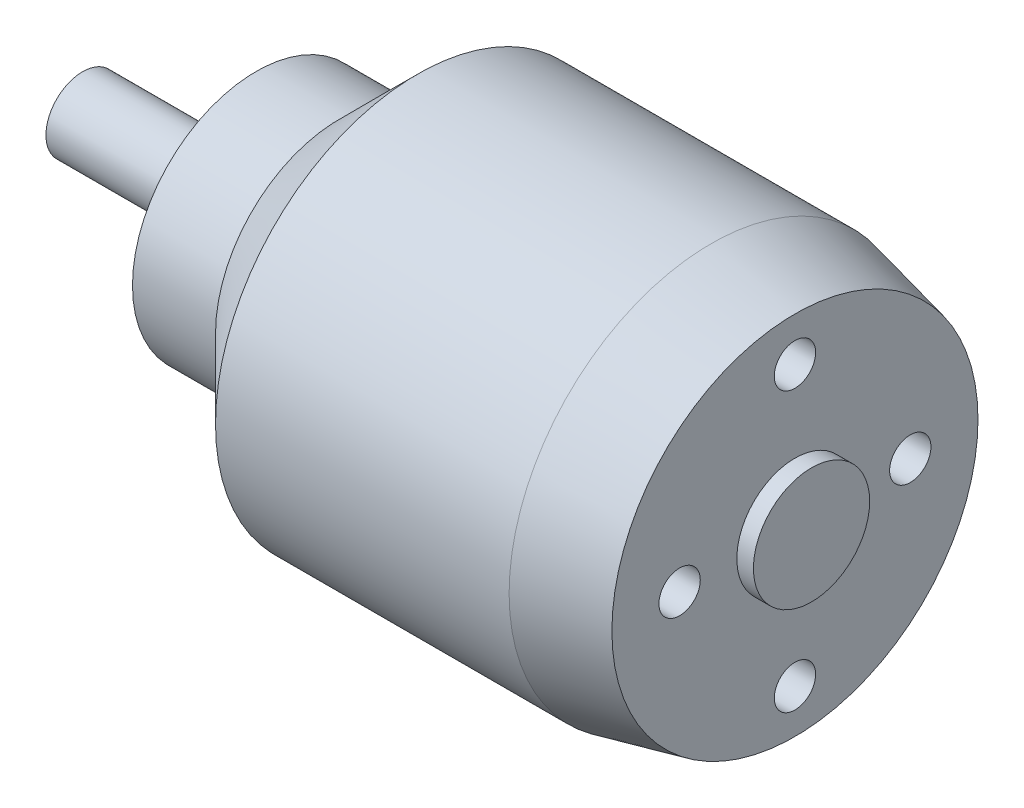
ISO-10303-21;
HEADER;
FILE_DESCRIPTION(('STEP AP214'),'2;1');
FILE_NAME('part.step','',(''),(''),'','','');
FILE_SCHEMA(('AUTOMOTIVE_DESIGN { 1 0 10303 214 1 1 1 1 }'));
ENDSEC;
DATA;
#1=APPLICATION_CONTEXT('core data for automotive mechanical design processes');
#2=APPLICATION_PROTOCOL_DEFINITION('international standard','automotive_design',2000,#1);
#3=PRODUCT_CONTEXT('',#1,'mechanical');
#4=PRODUCT('Part','Part','',(#3));
#5=PRODUCT_RELATED_PRODUCT_CATEGORY('part','',(#4));
#6=PRODUCT_DEFINITION_FORMATION('','',#4);
#7=PRODUCT_DEFINITION_CONTEXT('part definition',#1,'design');
#8=PRODUCT_DEFINITION('design','',#6,#7);
#9=PRODUCT_DEFINITION_SHAPE('','',#8);
#10=(LENGTH_UNIT() NAMED_UNIT(*) SI_UNIT(.MILLI.,.METRE.));
#11=(NAMED_UNIT(*) PLANE_ANGLE_UNIT() SI_UNIT($,.RADIAN.));
#12=(NAMED_UNIT(*) SI_UNIT($,.STERADIAN.) SOLID_ANGLE_UNIT());
#13=UNCERTAINTY_MEASURE_WITH_UNIT(LENGTH_MEASURE(1.E-05),#10,'distance_accuracy_value','');
#14=(GEOMETRIC_REPRESENTATION_CONTEXT(3) GLOBAL_UNCERTAINTY_ASSIGNED_CONTEXT((#13)) GLOBAL_UNIT_ASSIGNED_CONTEXT((#10,
#11,#12)) REPRESENTATION_CONTEXT('',''));
#15=CARTESIAN_POINT('',(0.,0.,0.));
#16=DIRECTION('',(0.,0.,1.));
#17=DIRECTION('',(1.,0.,0.));
#18=AXIS2_PLACEMENT_3D('',#15,#16,#17);
#19=CARTESIAN_POINT('',(0.,0.,4.0005));
#20=DIRECTION('',(-1.,0.,0.));
#21=DIRECTION('',(0.,0.,1.));
#22=AXIS2_PLACEMENT_3D('',#19,#20,#21);
#23=PLANE('',#22);
#24=CARTESIAN_POINT('',(0.,0.,0.));
#25=DIRECTION('',(1.,0.,0.));
#26=DIRECTION('',(0.,0.,-1.));
#27=AXIS2_PLACEMENT_3D('',#24,#25,#26);
#28=CIRCLE('',#27,4.0005);
#29=CARTESIAN_POINT('',(0.,0.,-4.0005));
#30=VERTEX_POINT('',#29);
#31=EDGE_CURVE('E81',#30,#30,#28,.T.);
#32=ORIENTED_EDGE('',*,*,#31,.T.);
#33=EDGE_LOOP('',(#32));
#34=FACE_BOUND('',#33,.T.);
#35=ADVANCED_FACE('F42',(#34),#23,.F.);
#36=CARTESIAN_POINT('',(-50.165,0.,0.));
#37=DIRECTION('',(1.,0.,0.));
#38=DIRECTION('',(0.,0.,-1.));
#39=AXIS2_PLACEMENT_3D('',#36,#37,#38);
#40=PLANE('',#39);
#41=CARTESIAN_POINT('',(-50.165,0.,0.));
#42=DIRECTION('',(1.,0.,0.));
#43=DIRECTION('',(0.,0.,-1.));
#44=AXIS2_PLACEMENT_3D('',#41,#42,#43);
#45=CIRCLE('',#44,2.5273);
#46=CARTESIAN_POINT('',(-50.165,0.,-2.5273));
#47=VERTEX_POINT('',#46);
#48=EDGE_CURVE('E10',#47,#47,#45,.T.);
#49=ORIENTED_EDGE('',*,*,#48,.F.);
#50=EDGE_LOOP('',(#49));
#51=FACE_BOUND('',#50,.T.);
#52=ADVANCED_FACE('F173',(#51),#40,.F.);
#53=CARTESIAN_POINT('',(0.,0.,0.));
#54=DIRECTION('',(1.,0.,0.));
#55=DIRECTION('',(0.,0.,-1.));
#56=AXIS2_PLACEMENT_3D('',#53,#54,#55);
#57=CYLINDRICAL_SURFACE('',#56,2.5273);
#58=CARTESIAN_POINT('',(-38.227,0.,0.));
#59=DIRECTION('',(1.,0.,0.));
#60=DIRECTION('',(0.,0.,-1.));
#61=AXIS2_PLACEMENT_3D('',#58,#59,#60);
#62=CIRCLE('',#61,2.5273);
#63=CARTESIAN_POINT('',(-38.227,0.,-2.5273));
#64=VERTEX_POINT('',#63);
#65=EDGE_CURVE('E49',#64,#64,#62,.T.);
#66=ORIENTED_EDGE('',*,*,#65,.F.);
#67=EDGE_LOOP('',(#66));
#68=FACE_BOUND('',#67,.T.);
#69=ORIENTED_EDGE('',*,*,#48,.T.);
#70=EDGE_LOOP('',(#69));
#71=FACE_BOUND('',#70,.T.);
#72=ADVANCED_FACE('F168',(#68,#71),#57,.T.);
#73=CARTESIAN_POINT('',(-38.227,0.,2.5273));
#74=DIRECTION('',(1.,0.,0.));
#75=DIRECTION('',(0.,0.,-1.));
#76=AXIS2_PLACEMENT_3D('',#73,#74,#75);
#77=PLANE('',#76);
#78=CARTESIAN_POINT('',(-38.227,0.,0.));
#79=DIRECTION('',(1.,0.,0.));
#80=DIRECTION('',(0.,0.,-1.));
#81=AXIS2_PLACEMENT_3D('',#78,#79,#80);
#82=CIRCLE('',#81,8.509);
#83=CARTESIAN_POINT('',(-38.227,0.,-8.509));
#84=VERTEX_POINT('',#83);
#85=EDGE_CURVE('E54',#84,#84,#82,.T.);
#86=ORIENTED_EDGE('',*,*,#85,.F.);
#87=EDGE_LOOP('',(#86));
#88=FACE_BOUND('',#87,.T.);
#89=ORIENTED_EDGE('',*,*,#65,.T.);
#90=EDGE_LOOP('',(#89));
#91=FACE_BOUND('',#90,.T.);
#92=ADVANCED_FACE('F163',(#88,#91),#77,.F.);
#93=CARTESIAN_POINT('',(0.,0.,0.));
#94=DIRECTION('',(1.,0.,0.));
#95=DIRECTION('',(0.,0.,-1.));
#96=AXIS2_PLACEMENT_3D('',#93,#94,#95);
#97=CYLINDRICAL_SURFACE('',#96,8.509);
#98=CARTESIAN_POINT('',(-32.512,0.,0.));
#99=DIRECTION('',(1.,0.,0.));
#100=DIRECTION('',(0.,0.,-1.));
#101=AXIS2_PLACEMENT_3D('',#98,#99,#100);
#102=CIRCLE('',#101,8.509);
#103=CARTESIAN_POINT('',(-32.512,0.,-8.509));
#104=VERTEX_POINT('',#103);
#105=EDGE_CURVE('E59',#104,#104,#102,.T.);
#106=ORIENTED_EDGE('',*,*,#105,.F.);
#107=EDGE_LOOP('',(#106));
#108=FACE_BOUND('',#107,.T.);
#109=ORIENTED_EDGE('',*,*,#85,.T.);
#110=EDGE_LOOP('',(#109));
#111=FACE_BOUND('',#110,.T.);
#112=ADVANCED_FACE('F157',(#108,#111),#97,.T.);
#113=CARTESIAN_POINT('',(-32.512,0.,0.));
#114=DIRECTION('',(1.,0.,0.));
#115=DIRECTION('',(0.,0.,-1.));
#116=AXIS2_PLACEMENT_3D('',#113,#114,#115);
#117=CONICAL_SURFACE('',#116,8.509,0.78539816339745);
#118=CARTESIAN_POINT('',(-27.1145,0.,0.));
#119=DIRECTION('',(1.,0.,0.));
#120=DIRECTION('',(0.,0.,-1.));
#121=AXIS2_PLACEMENT_3D('',#118,#119,#120);
#122=CIRCLE('',#121,13.9065);
#123=CARTESIAN_POINT('',(-27.1145,0.,-13.9065));
#124=VERTEX_POINT('',#123);
#125=EDGE_CURVE('E65',#124,#124,#122,.T.);
#126=ORIENTED_EDGE('',*,*,#125,.F.);
#127=EDGE_LOOP('',(#126));
#128=FACE_BOUND('',#127,.T.);
#129=ORIENTED_EDGE('',*,*,#105,.T.);
#130=EDGE_LOOP('',(#129));
#131=FACE_BOUND('',#130,.T.);
#132=ADVANCED_FACE('F151',(#128,#131),#117,.T.);
#133=CARTESIAN_POINT('',(0.,0.,0.));
#134=DIRECTION('',(1.,0.,0.));
#135=DIRECTION('',(0.,0.,-1.));
#136=AXIS2_PLACEMENT_3D('',#133,#134,#135);
#137=CYLINDRICAL_SURFACE('',#136,13.9065);
#138=CARTESIAN_POINT('',(-6.9088,0.,0.));
#139=DIRECTION('',(1.,0.,0.));
#140=DIRECTION('',(0.,0.,-1.));
#141=AXIS2_PLACEMENT_3D('',#138,#139,#140);
#142=CIRCLE('',#141,13.9065);
#143=CARTESIAN_POINT('',(-6.9088,0.,-13.9065));
#144=VERTEX_POINT('',#143);
#145=EDGE_CURVE('E69',#144,#144,#142,.T.);
#146=ORIENTED_EDGE('',*,*,#145,.F.);
#147=EDGE_LOOP('',(#146));
#148=FACE_BOUND('',#147,.T.);
#149=ORIENTED_EDGE('',*,*,#125,.T.);
#150=EDGE_LOOP('',(#149));
#151=FACE_BOUND('',#150,.T.);
#152=ADVANCED_FACE('F145',(#148,#151),#137,.T.);
#153=CARTESIAN_POINT('',(-6.9088,0.,0.));
#154=DIRECTION('',(-1.,0.,0.));
#155=DIRECTION('',(0.,0.,1.));
#156=AXIS2_PLACEMENT_3D('',#153,#154,#155);
#157=CONICAL_SURFACE('',#156,13.9065,0.223095757590541);
#158=CARTESIAN_POINT('',(-1.143,0.,0.));
#159=DIRECTION('',(1.,0.,0.));
#160=DIRECTION('',(0.,0.,-1.));
#161=AXIS2_PLACEMENT_3D('',#158,#159,#160);
#162=CIRCLE('',#161,12.5984);
#163=CARTESIAN_POINT('',(-1.143,0.,-12.5984));
#164=VERTEX_POINT('',#163);
#165=EDGE_CURVE('E73',#164,#164,#162,.T.);
#166=ORIENTED_EDGE('',*,*,#165,.F.);
#167=EDGE_LOOP('',(#166));
#168=FACE_BOUND('',#167,.T.);
#169=ORIENTED_EDGE('',*,*,#145,.T.);
#170=EDGE_LOOP('',(#169));
#171=FACE_BOUND('',#170,.T.);
#172=ADVANCED_FACE('F131',(#168,#171),#157,.T.);
#173=CARTESIAN_POINT('',(-1.143,0.,4.0005));
#174=DIRECTION('',(-1.,0.,0.));
#175=DIRECTION('',(0.,0.,1.));
#176=AXIS2_PLACEMENT_3D('',#173,#174,#175);
#177=PLANE('',#176);
#178=CARTESIAN_POINT('',(-1.143,0.,7.9375));
#179=DIRECTION('',(1.,0.,0.));
#180=DIRECTION('',(0.,0.,-1.));
#181=AXIS2_PLACEMENT_3D('',#178,#179,#180);
#182=CIRCLE('',#181,1.4224);
#183=CARTESIAN_POINT('',(-1.143,0.,6.5151));
#184=VERTEX_POINT('',#183);
#185=EDGE_CURVE('E110',#184,#184,#182,.T.);
#186=ORIENTED_EDGE('',*,*,#185,.F.);
#187=EDGE_LOOP('',(#186));
#188=FACE_BOUND('',#187,.T.);
#189=CARTESIAN_POINT('',(-1.143,-9.5885,0.));
#190=DIRECTION('',(1.,0.,0.));
#191=DIRECTION('',(0.,0.,-1.));
#192=AXIS2_PLACEMENT_3D('',#189,#190,#191);
#193=CIRCLE('',#192,1.4224);
#194=CARTESIAN_POINT('',(-1.143,-9.5885,-1.4224));
#195=VERTEX_POINT('',#194);
#196=EDGE_CURVE('E106',#195,#195,#193,.T.);
#197=ORIENTED_EDGE('',*,*,#196,.F.);
#198=EDGE_LOOP('',(#197));
#199=FACE_BOUND('',#198,.T.);
#200=CARTESIAN_POINT('',(-1.143,0.,-7.9375));
#201=DIRECTION('',(1.,0.,0.));
#202=DIRECTION('',(0.,0.,1.));
#203=AXIS2_PLACEMENT_3D('',#200,#201,#202);
#204=CIRCLE('',#203,1.4224);
#205=CARTESIAN_POINT('',(-1.143,0.,-6.5151));
#206=VERTEX_POINT('',#205);
#207=EDGE_CURVE('E98',#206,#206,#204,.T.);
#208=ORIENTED_EDGE('',*,*,#207,.F.);
#209=EDGE_LOOP('',(#208));
#210=FACE_BOUND('',#209,.T.);
#211=CARTESIAN_POINT('',(-1.143,9.5885,0.));
#212=DIRECTION('',(1.,0.,0.));
#213=DIRECTION('',(0.,0.,1.));
#214=AXIS2_PLACEMENT_3D('',#211,#212,#213);
#215=CIRCLE('',#214,1.4224);
#216=CARTESIAN_POINT('',(-1.143,9.5885,1.4224));
#217=VERTEX_POINT('',#216);
#218=EDGE_CURVE('E90',#217,#217,#215,.T.);
#219=ORIENTED_EDGE('',*,*,#218,.F.);
#220=EDGE_LOOP('',(#219));
#221=FACE_BOUND('',#220,.T.);
#222=CARTESIAN_POINT('',(-1.143,0.,0.));
#223=DIRECTION('',(1.,0.,0.));
#224=DIRECTION('',(0.,0.,-1.));
#225=AXIS2_PLACEMENT_3D('',#222,#223,#224);
#226=CIRCLE('',#225,4.0005);
#227=CARTESIAN_POINT('',(-1.143,0.,-4.0005));
#228=VERTEX_POINT('',#227);
#229=EDGE_CURVE('E77',#228,#228,#226,.T.);
#230=ORIENTED_EDGE('',*,*,#229,.F.);
#231=EDGE_LOOP('',(#230));
#232=FACE_BOUND('',#231,.T.);
#233=ORIENTED_EDGE('',*,*,#165,.T.);
#234=EDGE_LOOP('',(#233));
#235=FACE_BOUND('',#234,.T.);
#236=ADVANCED_FACE('F127',(#188,#199,#210,#221,#232,#235),#177,.F.);
#237=CARTESIAN_POINT('',(0.,0.,0.));
#238=DIRECTION('',(1.,0.,0.));
#239=DIRECTION('',(0.,0.,-1.));
#240=AXIS2_PLACEMENT_3D('',#237,#238,#239);
#241=CYLINDRICAL_SURFACE('',#240,4.0005);
#242=ORIENTED_EDGE('',*,*,#31,.F.);
#243=EDGE_LOOP('',(#242));
#244=FACE_BOUND('',#243,.T.);
#245=ORIENTED_EDGE('',*,*,#229,.T.);
#246=EDGE_LOOP('',(#245));
#247=FACE_BOUND('',#246,.T.);
#248=ADVANCED_FACE('F130',(#244,#247),#241,.T.);
#249=CARTESIAN_POINT('',(-3.683,9.5885,0.));
#250=DIRECTION('',(1.,0.,0.));
#251=DIRECTION('',(0.,0.,-1.));
#252=AXIS2_PLACEMENT_3D('',#249,#250,#251);
#253=CYLINDRICAL_SURFACE('',#252,1.4224);
#254=CARTESIAN_POINT('',(-3.683,9.5885,0.));
#255=DIRECTION('',(1.,0.,0.));
#256=DIRECTION('',(0.,0.,1.));
#257=AXIS2_PLACEMENT_3D('',#254,#255,#256);
#258=CIRCLE('',#257,1.4224);
#259=CARTESIAN_POINT('',(-3.683,9.5885,1.4224));
#260=VERTEX_POINT('',#259);
#261=EDGE_CURVE('E86',#260,#260,#258,.T.);
#262=ORIENTED_EDGE('',*,*,#261,.F.);
#263=EDGE_LOOP('',(#262));
#264=FACE_BOUND('',#263,.T.);
#265=ORIENTED_EDGE('',*,*,#218,.T.);
#266=EDGE_LOOP('',(#265));
#267=FACE_BOUND('',#266,.T.);
#268=ADVANCED_FACE('F186',(#264,#267),#253,.F.);
#269=CARTESIAN_POINT('',(-3.683,9.5885,0.));
#270=DIRECTION('',(-1.,0.,0.));
#271=DIRECTION('',(0.,0.,1.));
#272=AXIS2_PLACEMENT_3D('',#269,#270,#271);
#273=PLANE('',#272);
#274=ORIENTED_EDGE('',*,*,#261,.T.);
#275=EDGE_LOOP('',(#274));
#276=FACE_BOUND('',#275,.T.);
#277=ADVANCED_FACE('F191',(#276),#273,.F.);
#278=CARTESIAN_POINT('',(-3.683,0.,-7.9375));
#279=DIRECTION('',(1.,0.,0.));
#280=DIRECTION('',(0.,0.,-1.));
#281=AXIS2_PLACEMENT_3D('',#278,#279,#280);
#282=CYLINDRICAL_SURFACE('',#281,1.4224);
#283=CARTESIAN_POINT('',(-3.683,0.,-7.9375));
#284=DIRECTION('',(1.,0.,0.));
#285=DIRECTION('',(0.,0.,1.));
#286=AXIS2_PLACEMENT_3D('',#283,#284,#285);
#287=CIRCLE('',#286,1.4224);
#288=CARTESIAN_POINT('',(-3.683,0.,-6.5151));
#289=VERTEX_POINT('',#288);
#290=EDGE_CURVE('E94',#289,#289,#287,.T.);
#291=ORIENTED_EDGE('',*,*,#290,.F.);
#292=EDGE_LOOP('',(#291));
#293=FACE_BOUND('',#292,.T.);
#294=ORIENTED_EDGE('',*,*,#207,.T.);
#295=EDGE_LOOP('',(#294));
#296=FACE_BOUND('',#295,.T.);
#297=ADVANCED_FACE('F196',(#293,#296),#282,.F.);
#298=CARTESIAN_POINT('',(-3.683,0.,-7.9375));
#299=DIRECTION('',(-1.,0.,0.));
#300=DIRECTION('',(0.,0.,1.));
#301=AXIS2_PLACEMENT_3D('',#298,#299,#300);
#302=PLANE('',#301);
#303=ORIENTED_EDGE('',*,*,#290,.T.);
#304=EDGE_LOOP('',(#303));
#305=FACE_BOUND('',#304,.T.);
#306=ADVANCED_FACE('F199',(#305),#302,.F.);
#307=CARTESIAN_POINT('',(-3.683,-9.5885,0.));
#308=DIRECTION('',(1.,0.,0.));
#309=DIRECTION('',(0.,0.,-1.));
#310=AXIS2_PLACEMENT_3D('',#307,#308,#309);
#311=CYLINDRICAL_SURFACE('',#310,1.4224);
#312=CARTESIAN_POINT('',(-3.683,-9.5885,0.));
#313=DIRECTION('',(1.,0.,0.));
#314=DIRECTION('',(0.,0.,-1.));
#315=AXIS2_PLACEMENT_3D('',#312,#313,#314);
#316=CIRCLE('',#315,1.4224);
#317=CARTESIAN_POINT('',(-3.683,-9.5885,-1.4224));
#318=VERTEX_POINT('',#317);
#319=EDGE_CURVE('E102',#318,#318,#316,.T.);
#320=ORIENTED_EDGE('',*,*,#319,.F.);
#321=EDGE_LOOP('',(#320));
#322=FACE_BOUND('',#321,.T.);
#323=ORIENTED_EDGE('',*,*,#196,.T.);
#324=EDGE_LOOP('',(#323));
#325=FACE_BOUND('',#324,.T.);
#326=ADVANCED_FACE('F202',(#322,#325),#311,.F.);
#327=CARTESIAN_POINT('',(-3.683,-9.5885,0.));
#328=DIRECTION('',(1.,0.,0.));
#329=DIRECTION('',(0.,0.,-1.));
#330=AXIS2_PLACEMENT_3D('',#327,#328,#329);
#331=PLANE('',#330);
#332=ORIENTED_EDGE('',*,*,#319,.T.);
#333=EDGE_LOOP('',(#332));
#334=FACE_BOUND('',#333,.T.);
#335=ADVANCED_FACE('F123',(#334),#331,.T.);
#336=CARTESIAN_POINT('',(-3.683,0.,7.9375));
#337=DIRECTION('',(1.,0.,0.));
#338=DIRECTION('',(0.,0.,-1.));
#339=AXIS2_PLACEMENT_3D('',#336,#337,#338);
#340=CYLINDRICAL_SURFACE('',#339,1.4224);
#341=CARTESIAN_POINT('',(-3.683,0.,7.9375));
#342=DIRECTION('',(1.,0.,0.));
#343=DIRECTION('',(0.,0.,-1.));
#344=AXIS2_PLACEMENT_3D('',#341,#342,#343);
#345=CIRCLE('',#344,1.4224);
#346=CARTESIAN_POINT('',(-3.683,0.,6.5151));
#347=VERTEX_POINT('',#346);
#348=EDGE_CURVE('E85',#347,#347,#345,.T.);
#349=ORIENTED_EDGE('',*,*,#348,.F.);
#350=EDGE_LOOP('',(#349));
#351=FACE_BOUND('',#350,.T.);
#352=ORIENTED_EDGE('',*,*,#185,.T.);
#353=EDGE_LOOP('',(#352));
#354=FACE_BOUND('',#353,.T.);
#355=ADVANCED_FACE('F120',(#351,#354),#340,.F.);
#356=CARTESIAN_POINT('',(-3.683,0.,7.9375));
#357=DIRECTION('',(1.,0.,0.));
#358=DIRECTION('',(0.,0.,-1.));
#359=AXIS2_PLACEMENT_3D('',#356,#357,#358);
#360=PLANE('',#359);
#361=ORIENTED_EDGE('',*,*,#348,.T.);
#362=EDGE_LOOP('',(#361));
#363=FACE_BOUND('',#362,.T.);
#364=ADVANCED_FACE('F118',(#363),#360,.T.);
#365=CLOSED_SHELL('',(#35,#52,#72,#92,#112,#132,#152,#172,#236,#248,#268,#277,#297,#306,#326,
#335,#355,#364));
#366=MANIFOLD_SOLID_BREP('B2',#365);
#367=ADVANCED_BREP_SHAPE_REPRESENTATION('',(#18,#366),#14);
#368=SHAPE_DEFINITION_REPRESENTATION(#9,#367);
ENDSEC;
END-ISO-10303-21;
